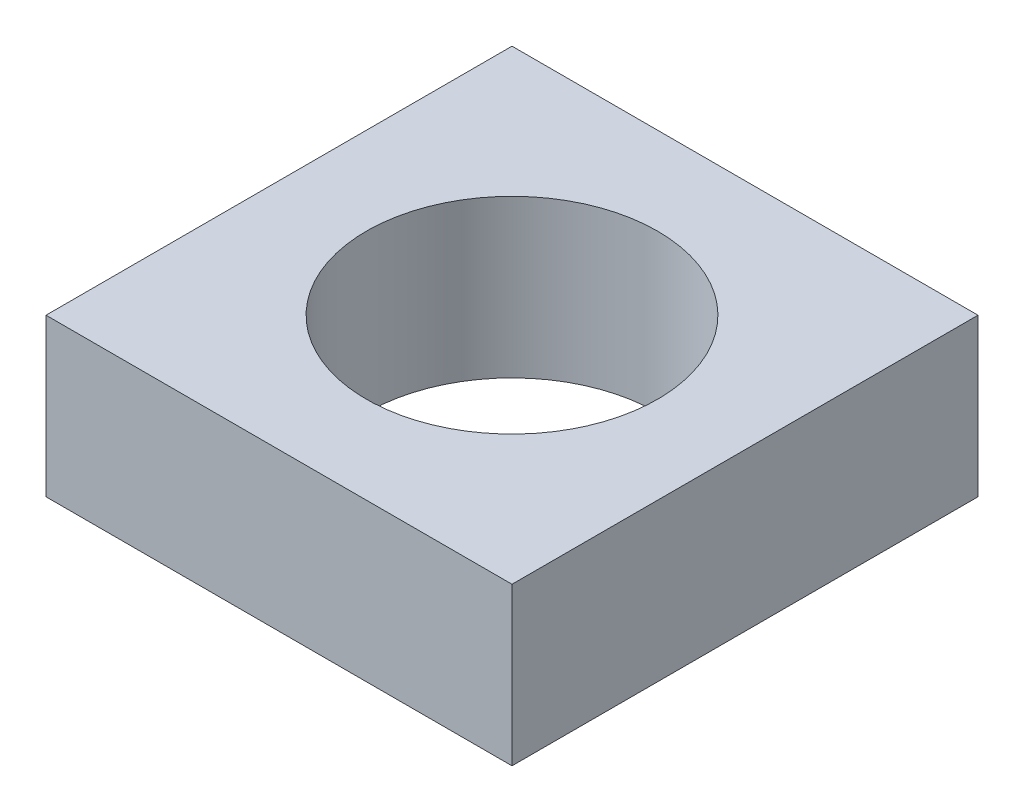
ISO-10303-21;
HEADER;
FILE_DESCRIPTION(('STEP AP214'),'2;1');
FILE_NAME('part.step','',(''),(''),'','','');
FILE_SCHEMA(('AUTOMOTIVE_DESIGN { 1 0 10303 214 1 1 1 1 }'));
ENDSEC;
DATA;
#1=APPLICATION_CONTEXT('core data for automotive mechanical design processes');
#2=APPLICATION_PROTOCOL_DEFINITION('international standard','automotive_design',2000,#1);
#3=PRODUCT_CONTEXT('',#1,'mechanical');
#4=PRODUCT('Part','Part','',(#3));
#5=PRODUCT_RELATED_PRODUCT_CATEGORY('part','',(#4));
#6=PRODUCT_DEFINITION_FORMATION('','',#4);
#7=PRODUCT_DEFINITION_CONTEXT('part definition',#1,'design');
#8=PRODUCT_DEFINITION('design','',#6,#7);
#9=PRODUCT_DEFINITION_SHAPE('','',#8);
#10=(LENGTH_UNIT() NAMED_UNIT(*) SI_UNIT(.MILLI.,.METRE.));
#11=(NAMED_UNIT(*) PLANE_ANGLE_UNIT() SI_UNIT($,.RADIAN.));
#12=(NAMED_UNIT(*) SI_UNIT($,.STERADIAN.) SOLID_ANGLE_UNIT());
#13=UNCERTAINTY_MEASURE_WITH_UNIT(LENGTH_MEASURE(1.E-05),#10,'distance_accuracy_value','');
#14=(GEOMETRIC_REPRESENTATION_CONTEXT(3) GLOBAL_UNCERTAINTY_ASSIGNED_CONTEXT((#13)) GLOBAL_UNIT_ASSIGNED_CONTEXT((#10,
#11,#12)) REPRESENTATION_CONTEXT('',''));
#15=CARTESIAN_POINT('',(0.,0.,0.));
#16=DIRECTION('',(0.,0.,1.));
#17=DIRECTION('',(1.,0.,0.));
#18=AXIS2_PLACEMENT_3D('',#15,#16,#17);
#19=CARTESIAN_POINT('',(-4.,1.35,4.));
#20=DIRECTION('',(0.,1.,0.));
#21=DIRECTION('',(0.,0.,1.));
#22=AXIS2_PLACEMENT_3D('',#19,#20,#21);
#23=PLANE('',#22);
#24=DIRECTION('',(0.,0.,1.));
#25=VECTOR('',#24,1.);
#26=CARTESIAN_POINT('',(-4.,1.35,-4.));
#27=LINE('',#26,#25);
#28=CARTESIAN_POINT('',(-4.,1.35,-4.));
#29=VERTEX_POINT('',#28);
#30=CARTESIAN_POINT('',(-4.,1.35,4.));
#31=VERTEX_POINT('',#30);
#32=EDGE_CURVE('E93',#29,#31,#27,.T.);
#33=ORIENTED_EDGE('',*,*,#32,.T.);
#34=DIRECTION('',(1.,0.,0.));
#35=VECTOR('',#34,1.);
#36=CARTESIAN_POINT('',(-4.,1.35,4.));
#37=LINE('',#36,#35);
#38=CARTESIAN_POINT('',(4.,1.35,4.));
#39=VERTEX_POINT('',#38);
#40=EDGE_CURVE('E88',#31,#39,#37,.T.);
#41=ORIENTED_EDGE('',*,*,#40,.T.);
#42=DIRECTION('',(0.,0.,-1.));
#43=VECTOR('',#42,1.);
#44=CARTESIAN_POINT('',(4.,1.35,-4.));
#45=LINE('',#44,#43);
#46=CARTESIAN_POINT('',(4.,1.35,-4.));
#47=VERTEX_POINT('',#46);
#48=EDGE_CURVE('E91',#39,#47,#45,.T.);
#49=ORIENTED_EDGE('',*,*,#48,.T.);
#50=DIRECTION('',(-1.,0.,0.));
#51=VECTOR('',#50,1.);
#52=CARTESIAN_POINT('',(-4.,1.35,-4.));
#53=LINE('',#52,#51);
#54=EDGE_CURVE('E58',#47,#29,#53,.T.);
#55=ORIENTED_EDGE('',*,*,#54,.T.);
#56=EDGE_LOOP('',(#33,#41,#49,#55));
#57=FACE_BOUND('',#56,.T.);
#58=CARTESIAN_POINT('',(0.,1.35,0.));
#59=DIRECTION('',(0.,1.,0.));
#60=DIRECTION('',(0.,0.,1.));
#61=AXIS2_PLACEMENT_3D('',#58,#59,#60);
#62=CIRCLE('',#61,2.5);
#63=CARTESIAN_POINT('',(0.,1.35,-2.5));
#64=VERTEX_POINT('',#63);
#65=EDGE_CURVE('E108',#64,#64,#62,.T.);
#66=ORIENTED_EDGE('',*,*,#65,.F.);
#67=EDGE_LOOP('',(#66));
#68=FACE_BOUND('',#67,.T.);
#69=ADVANCED_FACE('F41',(#57,#68),#23,.T.);
#70=CARTESIAN_POINT('',(-4.,-1.35,4.));
#71=DIRECTION('',(0.,1.,0.));
#72=DIRECTION('',(0.,0.,1.));
#73=AXIS2_PLACEMENT_3D('',#70,#71,#72);
#74=PLANE('',#73);
#75=DIRECTION('',(0.,0.,1.));
#76=VECTOR('',#75,1.);
#77=CARTESIAN_POINT('',(-4.,-1.35,-4.));
#78=LINE('',#77,#76);
#79=CARTESIAN_POINT('',(-4.,-1.35,-4.));
#80=VERTEX_POINT('',#79);
#81=CARTESIAN_POINT('',(-4.,-1.35,4.));
#82=VERTEX_POINT('',#81);
#83=EDGE_CURVE('E105',#80,#82,#78,.T.);
#84=ORIENTED_EDGE('',*,*,#83,.F.);
#85=DIRECTION('',(-1.,0.,0.));
#86=VECTOR('',#85,1.);
#87=CARTESIAN_POINT('',(-4.,-1.35,-4.));
#88=LINE('',#87,#86);
#89=CARTESIAN_POINT('',(4.,-1.35,-4.));
#90=VERTEX_POINT('',#89);
#91=EDGE_CURVE('E81',#90,#80,#88,.T.);
#92=ORIENTED_EDGE('',*,*,#91,.F.);
#93=DIRECTION('',(0.,0.,-1.));
#94=VECTOR('',#93,1.);
#95=CARTESIAN_POINT('',(4.,-1.35,-4.));
#96=LINE('',#95,#94);
#97=CARTESIAN_POINT('',(4.,-1.35,4.));
#98=VERTEX_POINT('',#97);
#99=EDGE_CURVE('E75',#98,#90,#96,.T.);
#100=ORIENTED_EDGE('',*,*,#99,.F.);
#101=DIRECTION('',(1.,0.,0.));
#102=VECTOR('',#101,1.);
#103=CARTESIAN_POINT('',(-4.,-1.35,4.));
#104=LINE('',#103,#102);
#105=EDGE_CURVE('E97',#82,#98,#104,.T.);
#106=ORIENTED_EDGE('',*,*,#105,.F.);
#107=EDGE_LOOP('',(#84,#92,#100,#106));
#108=FACE_BOUND('',#107,.T.);
#109=CARTESIAN_POINT('',(0.,-1.35,0.));
#110=DIRECTION('',(0.,1.,0.));
#111=DIRECTION('',(0.,0.,1.));
#112=AXIS2_PLACEMENT_3D('',#109,#110,#111);
#113=CIRCLE('',#112,2.5);
#114=CARTESIAN_POINT('',(0.,-1.35,-2.5));
#115=VERTEX_POINT('',#114);
#116=EDGE_CURVE('E120',#115,#115,#113,.T.);
#117=ORIENTED_EDGE('',*,*,#116,.T.);
#118=EDGE_LOOP('',(#117));
#119=FACE_BOUND('',#118,.T.);
#120=ADVANCED_FACE('F116',(#108,#119),#74,.F.);
#121=CARTESIAN_POINT('',(-4.,1.35,-4.));
#122=DIRECTION('',(1.,0.,0.));
#123=DIRECTION('',(0.,0.,-1.));
#124=AXIS2_PLACEMENT_3D('',#121,#122,#123);
#125=PLANE('',#124);
#126=ORIENTED_EDGE('',*,*,#83,.T.);
#127=DIRECTION('',(0.,-1.,0.));
#128=VECTOR('',#127,1.);
#129=CARTESIAN_POINT('',(-4.,1.35,4.));
#130=LINE('',#129,#128);
#131=EDGE_CURVE('E11',#31,#82,#130,.T.);
#132=ORIENTED_EDGE('',*,*,#131,.F.);
#133=ORIENTED_EDGE('',*,*,#32,.F.);
#134=DIRECTION('',(0.,-1.,0.));
#135=VECTOR('',#134,1.);
#136=CARTESIAN_POINT('',(-4.,1.35,-4.));
#137=LINE('',#136,#135);
#138=EDGE_CURVE('E101',#29,#80,#137,.T.);
#139=ORIENTED_EDGE('',*,*,#138,.T.);
#140=EDGE_LOOP('',(#126,#132,#133,#139));
#141=FACE_BOUND('',#140,.T.);
#142=ADVANCED_FACE('F43',(#141),#125,.F.);
#143=CARTESIAN_POINT('',(-4.,1.35,4.));
#144=DIRECTION('',(0.,0.,-1.));
#145=DIRECTION('',(-1.,0.,0.));
#146=AXIS2_PLACEMENT_3D('',#143,#144,#145);
#147=PLANE('',#146);
#148=ORIENTED_EDGE('',*,*,#105,.T.);
#149=DIRECTION('',(0.,-1.,0.));
#150=VECTOR('',#149,1.);
#151=CARTESIAN_POINT('',(4.,1.35,4.));
#152=LINE('',#151,#150);
#153=EDGE_CURVE('E50',#39,#98,#152,.T.);
#154=ORIENTED_EDGE('',*,*,#153,.F.);
#155=ORIENTED_EDGE('',*,*,#40,.F.);
#156=ORIENTED_EDGE('',*,*,#131,.T.);
#157=EDGE_LOOP('',(#148,#154,#155,#156));
#158=FACE_BOUND('',#157,.T.);
#159=ADVANCED_FACE('F96',(#158),#147,.F.);
#160=CARTESIAN_POINT('',(4.,1.35,-4.));
#161=DIRECTION('',(-1.,0.,0.));
#162=DIRECTION('',(0.,0.,1.));
#163=AXIS2_PLACEMENT_3D('',#160,#161,#162);
#164=PLANE('',#163);
#165=ORIENTED_EDGE('',*,*,#99,.T.);
#166=DIRECTION('',(0.,-1.,0.));
#167=VECTOR('',#166,1.);
#168=CARTESIAN_POINT('',(4.,1.35,-4.));
#169=LINE('',#168,#167);
#170=EDGE_CURVE('E98',#47,#90,#169,.T.);
#171=ORIENTED_EDGE('',*,*,#170,.F.);
#172=ORIENTED_EDGE('',*,*,#48,.F.);
#173=ORIENTED_EDGE('',*,*,#153,.T.);
#174=EDGE_LOOP('',(#165,#171,#172,#173));
#175=FACE_BOUND('',#174,.T.);
#176=ADVANCED_FACE('F99',(#175),#164,.F.);
#177=CARTESIAN_POINT('',(-4.,1.35,-4.));
#178=DIRECTION('',(0.,0.,1.));
#179=DIRECTION('',(1.,0.,0.));
#180=AXIS2_PLACEMENT_3D('',#177,#178,#179);
#181=PLANE('',#180);
#182=ORIENTED_EDGE('',*,*,#91,.T.);
#183=ORIENTED_EDGE('',*,*,#138,.F.);
#184=ORIENTED_EDGE('',*,*,#54,.F.);
#185=ORIENTED_EDGE('',*,*,#170,.T.);
#186=EDGE_LOOP('',(#182,#183,#184,#185));
#187=FACE_BOUND('',#186,.T.);
#188=ADVANCED_FACE('F113',(#187),#181,.F.);
#189=CARTESIAN_POINT('',(0.,1.35,0.));
#190=DIRECTION('',(0.,-1.,0.));
#191=DIRECTION('',(0.,0.,-1.));
#192=AXIS2_PLACEMENT_3D('',#189,#190,#191);
#193=CYLINDRICAL_SURFACE('',#192,2.5);
#194=CARTESIAN_POINT('',(0.,1.35,-2.5));
#195=CARTESIAN_POINT('',(0.,1.321875,-2.5));
#196=CARTESIAN_POINT('',(0.,1.29375,-2.5));
#197=CARTESIAN_POINT('',(0.,1.2375,-2.5));
#198=CARTESIAN_POINT('',(0.,1.209375,-2.5));
#199=CARTESIAN_POINT('',(0.,1.153125,-2.5));
#200=CARTESIAN_POINT('',(0.,1.125,-2.5));
#201=CARTESIAN_POINT('',(0.,1.06875,-2.5));
#202=CARTESIAN_POINT('',(0.,1.040625,-2.5));
#203=CARTESIAN_POINT('',(0.,0.984375,-2.5));
#204=CARTESIAN_POINT('',(0.,0.95625,-2.5));
#205=CARTESIAN_POINT('',(0.,0.9,-2.5));
#206=CARTESIAN_POINT('',(0.,0.871875,-2.5));
#207=CARTESIAN_POINT('',(0.,0.815625,-2.5));
#208=CARTESIAN_POINT('',(0.,0.7875,-2.5));
#209=CARTESIAN_POINT('',(0.,0.73125,-2.5));
#210=CARTESIAN_POINT('',(0.,0.703125,-2.5));
#211=CARTESIAN_POINT('',(0.,0.646875,-2.5));
#212=CARTESIAN_POINT('',(0.,0.61875,-2.5));
#213=CARTESIAN_POINT('',(0.,0.5625,-2.5));
#214=CARTESIAN_POINT('',(0.,0.534375,-2.5));
#215=CARTESIAN_POINT('',(0.,0.478125,-2.5));
#216=CARTESIAN_POINT('',(0.,0.45,-2.5));
#217=CARTESIAN_POINT('',(0.,0.39375,-2.5));
#218=CARTESIAN_POINT('',(0.,0.365625,-2.5));
#219=CARTESIAN_POINT('',(0.,0.309375,-2.5));
#220=CARTESIAN_POINT('',(0.,0.28125,-2.5));
#221=CARTESIAN_POINT('',(0.,0.225,-2.5));
#222=CARTESIAN_POINT('',(0.,0.196875,-2.5));
#223=CARTESIAN_POINT('',(0.,0.140625,-2.5));
#224=CARTESIAN_POINT('',(0.,0.1125,-2.5));
#225=CARTESIAN_POINT('',(0.,0.0562499999999996,-2.5));
#226=CARTESIAN_POINT('',(0.,0.0281249999999996,-2.5));
#227=CARTESIAN_POINT('',(0.,-0.0281250000000004,-2.5));
#228=CARTESIAN_POINT('',(0.,-0.0562500000000005,-2.5));
#229=CARTESIAN_POINT('',(0.,-0.1125,-2.5));
#230=CARTESIAN_POINT('',(0.,-0.140625,-2.5));
#231=CARTESIAN_POINT('',(0.,-0.196875000000001,-2.5));
#232=CARTESIAN_POINT('',(0.,-0.225000000000001,-2.5));
#233=CARTESIAN_POINT('',(0.,-0.28125,-2.5));
#234=CARTESIAN_POINT('',(0.,-0.309375000000001,-2.5));
#235=CARTESIAN_POINT('',(0.,-0.365625000000001,-2.5));
#236=CARTESIAN_POINT('',(0.,-0.393750000000001,-2.5));
#237=CARTESIAN_POINT('',(0.,-0.450000000000001,-2.5));
#238=CARTESIAN_POINT('',(0.,-0.478125000000001,-2.5));
#239=CARTESIAN_POINT('',(0.,-0.534375000000001,-2.5));
#240=CARTESIAN_POINT('',(0.,-0.562500000000001,-2.5));
#241=CARTESIAN_POINT('',(0.,-0.61875,-2.5));
#242=CARTESIAN_POINT('',(0.,-0.646875,-2.5));
#243=CARTESIAN_POINT('',(0.,-0.703125,-2.5));
#244=CARTESIAN_POINT('',(0.,-0.73125,-2.5));
#245=CARTESIAN_POINT('',(0.,-0.7875,-2.5));
#246=CARTESIAN_POINT('',(0.,-0.815625,-2.5));
#247=CARTESIAN_POINT('',(0.,-0.871875,-2.5));
#248=CARTESIAN_POINT('',(0.,-0.9,-2.5));
#249=CARTESIAN_POINT('',(0.,-0.95625,-2.5));
#250=CARTESIAN_POINT('',(0.,-0.984375,-2.5));
#251=CARTESIAN_POINT('',(0.,-1.040625,-2.5));
#252=CARTESIAN_POINT('',(0.,-1.06875,-2.5));
#253=CARTESIAN_POINT('',(0.,-1.125,-2.5));
#254=CARTESIAN_POINT('',(0.,-1.153125,-2.5));
#255=CARTESIAN_POINT('',(0.,-1.209375,-2.5));
#256=CARTESIAN_POINT('',(0.,-1.2375,-2.5));
#257=CARTESIAN_POINT('',(0.,-1.29375,-2.5));
#258=CARTESIAN_POINT('',(0.,-1.321875,-2.5));
#259=CARTESIAN_POINT('',(0.,-1.35,-2.5));
#260=B_SPLINE_CURVE_WITH_KNOTS('',3,(#194,#195,#196,#197,#198,#199,#200,#201,#202,#203,#204,
#205,#206,#207,#208,#209,#210,#211,#212,#213,#214,#215,#216,#217,#218,#219,#220,#221,#222,#223,
#224,#225,#226,#227,#228,#229,#230,#231,#232,#233,#234,#235,#236,#237,#238,#239,#240,#241,#242,
#243,#244,#245,#246,#247,#248,#249,#250,#251,#252,#253,#254,#255,#256,#257,#258,#259),
.UNSPECIFIED.,.F.,.F.,(4,2,2,2,2,2,2,2,2,2,2,2,2,2,2,2,2,2,2,2,2,2,2,2,2,2,2,2,2,2,2,2,4),(0.,
0.0843749999999998,0.16875,0.253125,0.3375,0.421875,0.50625,0.590625,0.675,0.759375,0.84375,
0.928125,1.0125,1.096875,1.18125,1.265625,1.35,1.434375,1.51875,1.603125,1.6875,1.771875,
1.85625,1.940625,2.025,2.109375,2.19375,2.278125,2.3625,2.446875,2.53125,2.615625,2.7),.UNSPECIFIED.);
#261=EDGE_CURVE('BSEAM126',#64,#115,#260,.T.);
#262=ORIENTED_EDGE('',*,*,#65,.T.);
#263=ORIENTED_EDGE('',*,*,#116,.F.);
#264=ORIENTED_EDGE('',*,*,#261,.T.);
#265=ORIENTED_EDGE('',*,*,#261,.F.);
#266=EDGE_LOOP('',(#262,#264,#263,#265));
#267=FACE_BOUND('',#266,.T.);
#268=ADVANCED_FACE('F126',(#267),#193,.F.);
#269=CLOSED_SHELL('',(#69,#120,#142,#159,#176,#188,#268));
#270=MANIFOLD_SOLID_BREP('B2',#269);
#271=ADVANCED_BREP_SHAPE_REPRESENTATION('',(#18,#270),#14);
#272=SHAPE_DEFINITION_REPRESENTATION(#9,#271);
ENDSEC;
END-ISO-10303-21;
